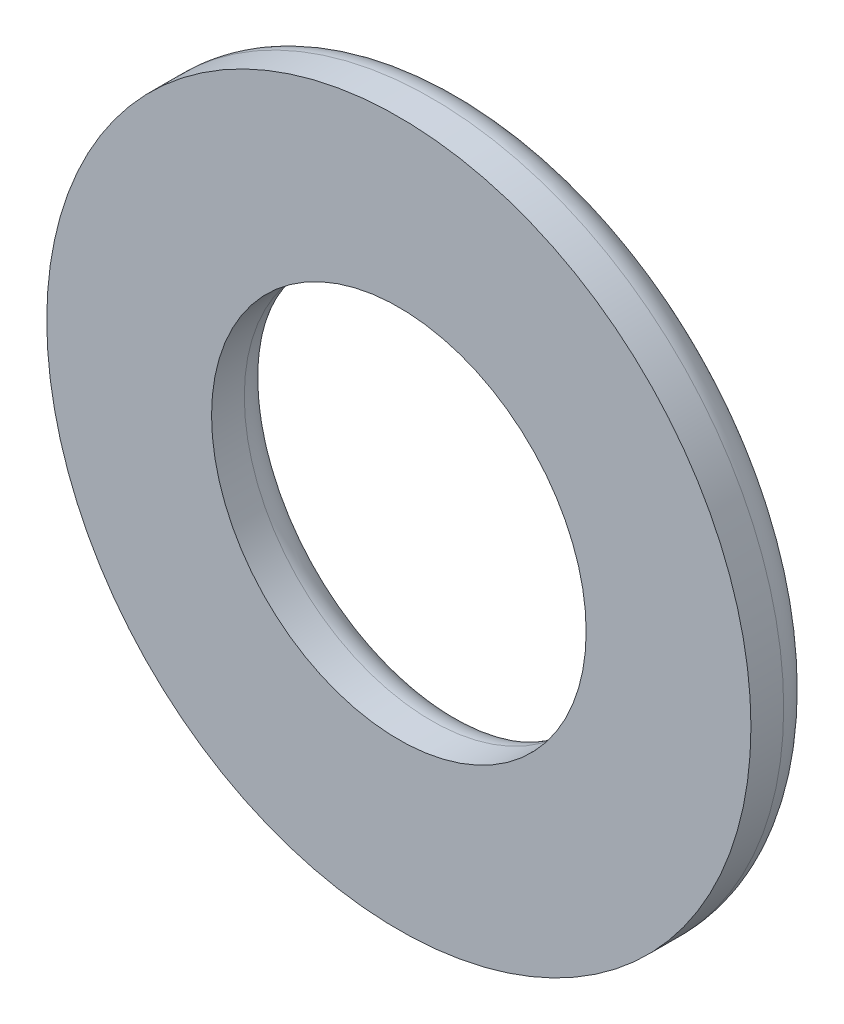
ISO-10303-21;
HEADER;
FILE_DESCRIPTION(('STEP AP214'),'2;1');
FILE_NAME('part.step','',(''),(''),'','','');
FILE_SCHEMA(('AUTOMOTIVE_DESIGN { 1 0 10303 214 1 1 1 1 }'));
ENDSEC;
DATA;
#1=APPLICATION_CONTEXT('core data for automotive mechanical design processes');
#2=APPLICATION_PROTOCOL_DEFINITION('international standard','automotive_design',2000,#1);
#3=PRODUCT_CONTEXT('',#1,'mechanical');
#4=PRODUCT('Part','Part','',(#3));
#5=PRODUCT_RELATED_PRODUCT_CATEGORY('part','',(#4));
#6=PRODUCT_DEFINITION_FORMATION('','',#4);
#7=PRODUCT_DEFINITION_CONTEXT('part definition',#1,'design');
#8=PRODUCT_DEFINITION('design','',#6,#7);
#9=PRODUCT_DEFINITION_SHAPE('','',#8);
#10=(LENGTH_UNIT() NAMED_UNIT(*) SI_UNIT(.MILLI.,.METRE.));
#11=(NAMED_UNIT(*) PLANE_ANGLE_UNIT() SI_UNIT($,.RADIAN.));
#12=(NAMED_UNIT(*) SI_UNIT($,.STERADIAN.) SOLID_ANGLE_UNIT());
#13=UNCERTAINTY_MEASURE_WITH_UNIT(LENGTH_MEASURE(1.E-05),#10,'distance_accuracy_value','');
#14=(GEOMETRIC_REPRESENTATION_CONTEXT(3) GLOBAL_UNCERTAINTY_ASSIGNED_CONTEXT((#13)) GLOBAL_UNIT_ASSIGNED_CONTEXT((#10,
#11,#12)) REPRESENTATION_CONTEXT('',''));
#15=CARTESIAN_POINT('',(0.,0.,0.));
#16=DIRECTION('',(0.,0.,1.));
#17=DIRECTION('',(1.,0.,0.));
#18=AXIS2_PLACEMENT_3D('',#15,#16,#17);
#19=CARTESIAN_POINT('',(0.,0.,0.590549999999995));
#20=DIRECTION('',(0.,0.,1.));
#21=DIRECTION('',(1.,0.,0.));
#22=AXIS2_PLACEMENT_3D('',#19,#20,#21);
#23=PLANE('',#22);
#24=CARTESIAN_POINT('',(0.,0.,0.590549999999995));
#25=DIRECTION('',(0.,0.,1.));
#26=DIRECTION('',(1.,0.,0.));
#27=AXIS2_PLACEMENT_3D('',#24,#25,#26);
#28=CIRCLE('',#27,6.35);
#29=CARTESIAN_POINT('',(6.35,0.,0.590549999999995));
#30=VERTEX_POINT('',#29);
#31=EDGE_CURVE('E55',#30,#30,#28,.T.);
#32=ORIENTED_EDGE('',*,*,#31,.T.);
#33=EDGE_LOOP('',(#32));
#34=FACE_BOUND('',#33,.T.);
#35=CARTESIAN_POINT('',(0.,0.,0.590549999999995));
#36=DIRECTION('',(0.,0.,1.));
#37=DIRECTION('',(1.,0.,0.));
#38=AXIS2_PLACEMENT_3D('',#35,#36,#37);
#39=CIRCLE('',#38,3.3782);
#40=CARTESIAN_POINT('',(3.3782,0.,0.590549999999995));
#41=VERTEX_POINT('',#40);
#42=EDGE_CURVE('E58',#41,#41,#39,.T.);
#43=ORIENTED_EDGE('',*,*,#42,.F.);
#44=EDGE_LOOP('',(#43));
#45=FACE_BOUND('',#44,.T.);
#46=ADVANCED_FACE('F35',(#34,#45),#23,.T.);
#47=CARTESIAN_POINT('',(0.,0.,0.590549999999995));
#48=DIRECTION('',(0.,0.,-1.));
#49=DIRECTION('',(-1.,0.,0.));
#50=AXIS2_PLACEMENT_3D('',#47,#48,#49);
#51=CYLINDRICAL_SURFACE('',#50,6.35);
#52=CARTESIAN_POINT('',(0.,0.,0.));
#53=DIRECTION('',(0.,0.,1.));
#54=DIRECTION('',(1.,0.,0.));
#55=AXIS2_PLACEMENT_3D('',#52,#53,#54);
#56=CIRCLE('',#55,6.35);
#57=CARTESIAN_POINT('',(6.35,0.,0.));
#58=VERTEX_POINT('',#57);
#59=EDGE_CURVE('E50',#58,#58,#56,.T.);
#60=ORIENTED_EDGE('',*,*,#59,.T.);
#61=EDGE_LOOP('',(#60));
#62=FACE_BOUND('',#61,.T.);
#63=ORIENTED_EDGE('',*,*,#31,.F.);
#64=EDGE_LOOP('',(#63));
#65=FACE_BOUND('',#64,.T.);
#66=ADVANCED_FACE('F65',(#62,#65),#51,.T.);
#67=CARTESIAN_POINT('',(0.,0.,0.590549999999995));
#68=DIRECTION('',(0.,0.,-1.));
#69=DIRECTION('',(-1.,0.,0.));
#70=AXIS2_PLACEMENT_3D('',#67,#68,#69);
#71=CYLINDRICAL_SURFACE('',#70,3.3782);
#72=CARTESIAN_POINT('',(0.,0.,0.));
#73=DIRECTION('',(0.,0.,1.));
#74=DIRECTION('',(1.,0.,0.));
#75=AXIS2_PLACEMENT_3D('',#72,#73,#74);
#76=CIRCLE('',#75,3.3782);
#77=CARTESIAN_POINT('',(3.3782,0.,0.));
#78=VERTEX_POINT('',#77);
#79=EDGE_CURVE('E10',#78,#78,#76,.F.);
#80=ORIENTED_EDGE('',*,*,#79,.T.);
#81=EDGE_LOOP('',(#80));
#82=FACE_BOUND('',#81,.T.);
#83=ORIENTED_EDGE('',*,*,#42,.T.);
#84=EDGE_LOOP('',(#83));
#85=FACE_BOUND('',#84,.T.);
#86=ADVANCED_FACE('F62',(#82,#85),#71,.F.);
#87=CARTESIAN_POINT('',(0.,0.,-0.590549999999995));
#88=DIRECTION('',(0.,0.,1.));
#89=DIRECTION('',(1.,0.,0.));
#90=AXIS2_PLACEMENT_3D('',#87,#88,#89);
#91=PLANE('',#90);
#92=CARTESIAN_POINT('',(0.,0.,-0.590549999999995));
#93=DIRECTION('',(0.,0.,1.));
#94=DIRECTION('',(1.,0.,0.));
#95=AXIS2_PLACEMENT_3D('',#92,#93,#94);
#96=CIRCLE('',#95,5.75945);
#97=CARTESIAN_POINT('',(5.75945,0.,-0.590549999999995));
#98=VERTEX_POINT('',#97);
#99=EDGE_CURVE('E42',#98,#98,#96,.F.);
#100=ORIENTED_EDGE('',*,*,#99,.T.);
#101=EDGE_LOOP('',(#100));
#102=FACE_BOUND('',#101,.T.);
#103=CARTESIAN_POINT('',(0.,0.,-0.590549999999995));
#104=DIRECTION('',(0.,0.,1.));
#105=DIRECTION('',(1.,0.,0.));
#106=AXIS2_PLACEMENT_3D('',#103,#104,#105);
#107=CIRCLE('',#106,3.96875);
#108=CARTESIAN_POINT('',(3.96875,0.,-0.590549999999995));
#109=VERTEX_POINT('',#108);
#110=EDGE_CURVE('E46',#109,#109,#107,.T.);
#111=ORIENTED_EDGE('',*,*,#110,.T.);
#112=EDGE_LOOP('',(#111));
#113=FACE_BOUND('',#112,.T.);
#114=ADVANCED_FACE('F77',(#102,#113),#91,.F.);
#115=CARTESIAN_POINT('',(0.,0.,0.));
#116=DIRECTION('',(0.,0.,1.));
#117=DIRECTION('',(1.,0.,0.));
#118=AXIS2_PLACEMENT_3D('',#115,#116,#117);
#119=TOROIDAL_SURFACE('',#118,5.75945,0.59055);
#120=ORIENTED_EDGE('',*,*,#99,.F.);
#121=EDGE_LOOP('',(#120));
#122=FACE_BOUND('',#121,.T.);
#123=ORIENTED_EDGE('',*,*,#59,.F.);
#124=EDGE_LOOP('',(#123));
#125=FACE_BOUND('',#124,.T.);
#126=ADVANCED_FACE('F75',(#122,#125),#119,.T.);
#127=CARTESIAN_POINT('',(0.,0.,0.));
#128=DIRECTION('',(0.,0.,1.));
#129=DIRECTION('',(1.,0.,0.));
#130=AXIS2_PLACEMENT_3D('',#127,#128,#129);
#131=TOROIDAL_SURFACE('',#130,3.96875,0.59055);
#132=ORIENTED_EDGE('',*,*,#79,.F.);
#133=EDGE_LOOP('',(#132));
#134=FACE_BOUND('',#133,.T.);
#135=ORIENTED_EDGE('',*,*,#110,.F.);
#136=EDGE_LOOP('',(#135));
#137=FACE_BOUND('',#136,.T.);
#138=ADVANCED_FACE('F37',(#134,#137),#131,.T.);
#139=CLOSED_SHELL('',(#46,#66,#86,#114,#126,#138));
#140=MANIFOLD_SOLID_BREP('B2',#139);
#141=ADVANCED_BREP_SHAPE_REPRESENTATION('',(#18,#140),#14);
#142=SHAPE_DEFINITION_REPRESENTATION(#9,#141);
ENDSEC;
END-ISO-10303-21;
